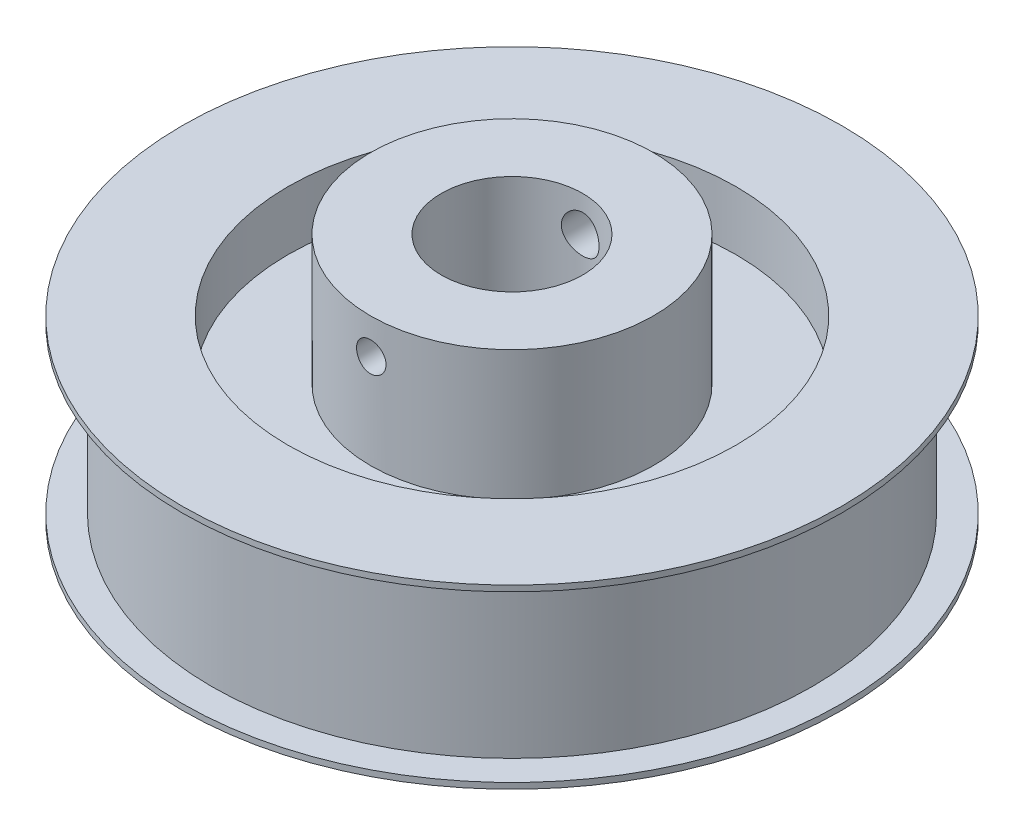
ISO-10303-21;
HEADER;
FILE_DESCRIPTION(('STEP AP214'),'2;1');
FILE_NAME('part.step','',(''),(''),'','','');
FILE_SCHEMA(('AUTOMOTIVE_DESIGN { 1 0 10303 214 1 1 1 1 }'));
ENDSEC;
DATA;
#1=APPLICATION_CONTEXT('core data for automotive mechanical design processes');
#2=APPLICATION_PROTOCOL_DEFINITION('international standard','automotive_design',2000,#1);
#3=PRODUCT_CONTEXT('',#1,'mechanical');
#4=PRODUCT('Part','Part','',(#3));
#5=PRODUCT_RELATED_PRODUCT_CATEGORY('part','',(#4));
#6=PRODUCT_DEFINITION_FORMATION('','',#4);
#7=PRODUCT_DEFINITION_CONTEXT('part definition',#1,'design');
#8=PRODUCT_DEFINITION('design','',#6,#7);
#9=PRODUCT_DEFINITION_SHAPE('','',#8);
#10=(LENGTH_UNIT() NAMED_UNIT(*) SI_UNIT(.MILLI.,.METRE.));
#11=(NAMED_UNIT(*) PLANE_ANGLE_UNIT() SI_UNIT($,.RADIAN.));
#12=(NAMED_UNIT(*) SI_UNIT($,.STERADIAN.) SOLID_ANGLE_UNIT());
#13=UNCERTAINTY_MEASURE_WITH_UNIT(LENGTH_MEASURE(1.E-05),#10,'distance_accuracy_value','');
#14=(GEOMETRIC_REPRESENTATION_CONTEXT(3) GLOBAL_UNCERTAINTY_ASSIGNED_CONTEXT((#13)) GLOBAL_UNIT_ASSIGNED_CONTEXT((#10,
#11,#12)) REPRESENTATION_CONTEXT('',''));
#15=CARTESIAN_POINT('',(0.,0.,0.));
#16=DIRECTION('',(0.,0.,1.));
#17=DIRECTION('',(1.,0.,0.));
#18=AXIS2_PLACEMENT_3D('',#15,#16,#17);
#19=CARTESIAN_POINT('',(0.,13.5,0.));
#20=DIRECTION('',(0.,1.,0.));
#21=DIRECTION('',(0.,0.,1.));
#22=AXIS2_PLACEMENT_3D('',#19,#20,#21);
#23=PLANE('',#22);
#24=CARTESIAN_POINT('',(0.,13.5,0.));
#25=DIRECTION('',(0.,1.,0.));
#26=DIRECTION('',(0.,0.,1.));
#27=AXIS2_PLACEMENT_3D('',#24,#25,#26);
#28=CIRCLE('',#27,6.);
#29=CARTESIAN_POINT('',(0.,13.5,6.));
#30=VERTEX_POINT('',#29);
#31=EDGE_CURVE('E69',#30,#30,#28,.T.);
#32=ORIENTED_EDGE('',*,*,#31,.F.);
#33=EDGE_LOOP('',(#32));
#34=FACE_BOUND('',#33,.T.);
#35=CARTESIAN_POINT('',(0.,13.5,0.));
#36=DIRECTION('',(0.,1.,0.));
#37=DIRECTION('',(0.,0.,1.));
#38=AXIS2_PLACEMENT_3D('',#35,#36,#37);
#39=CIRCLE('',#38,12.);
#40=CARTESIAN_POINT('',(0.,13.5,12.));
#41=VERTEX_POINT('',#40);
#42=EDGE_CURVE('E79',#41,#41,#39,.T.);
#43=ORIENTED_EDGE('',*,*,#42,.T.);
#44=EDGE_LOOP('',(#43));
#45=FACE_BOUND('',#44,.T.);
#46=ADVANCED_FACE('F43',(#34,#45),#23,.T.);
#47=CARTESIAN_POINT('',(0.,7.5,0.));
#48=DIRECTION('',(0.,-1.,0.));
#49=DIRECTION('',(0.,0.,-1.));
#50=AXIS2_PLACEMENT_3D('',#47,#48,#49);
#51=CYLINDRICAL_SURFACE('',#50,25.465);
#52=CARTESIAN_POINT('',(0.,-7.,0.));
#53=DIRECTION('',(0.,1.,0.));
#54=DIRECTION('',(0.,0.,1.));
#55=AXIS2_PLACEMENT_3D('',#52,#53,#54);
#56=CIRCLE('',#55,25.465);
#57=CARTESIAN_POINT('',(0.,-7.,25.465));
#58=VERTEX_POINT('',#57);
#59=EDGE_CURVE('E47',#58,#58,#56,.T.);
#60=ORIENTED_EDGE('',*,*,#59,.T.);
#61=EDGE_LOOP('',(#60));
#62=FACE_BOUND('',#61,.T.);
#63=CARTESIAN_POINT('',(0.,7.,0.));
#64=DIRECTION('',(0.,1.,0.));
#65=DIRECTION('',(0.,0.,1.));
#66=AXIS2_PLACEMENT_3D('',#63,#64,#65);
#67=CIRCLE('',#66,25.465);
#68=CARTESIAN_POINT('',(0.,7.,25.465));
#69=VERTEX_POINT('',#68);
#70=EDGE_CURVE('E11',#69,#69,#67,.T.);
#71=ORIENTED_EDGE('',*,*,#70,.F.);
#72=EDGE_LOOP('',(#71));
#73=FACE_BOUND('',#72,.T.);
#74=ADVANCED_FACE('F45',(#62,#73),#51,.T.);
#75=CARTESIAN_POINT('',(0.,7.,0.));
#76=DIRECTION('',(0.,1.,0.));
#77=DIRECTION('',(0.,0.,1.));
#78=AXIS2_PLACEMENT_3D('',#75,#76,#77);
#79=CYLINDRICAL_SURFACE('',#78,27.965);
#80=CARTESIAN_POINT('',(0.,7.,0.));
#81=DIRECTION('',(0.,1.,0.));
#82=DIRECTION('',(0.,0.,1.));
#83=AXIS2_PLACEMENT_3D('',#80,#81,#82);
#84=CIRCLE('',#83,27.965);
#85=CARTESIAN_POINT('',(0.,7.,27.965));
#86=VERTEX_POINT('',#85);
#87=EDGE_CURVE('E51',#86,#86,#84,.T.);
#88=ORIENTED_EDGE('',*,*,#87,.T.);
#89=EDGE_LOOP('',(#88));
#90=FACE_BOUND('',#89,.T.);
#91=CARTESIAN_POINT('',(0.,7.5,0.));
#92=DIRECTION('',(0.,1.,0.));
#93=DIRECTION('',(0.,0.,1.));
#94=AXIS2_PLACEMENT_3D('',#91,#92,#93);
#95=CIRCLE('',#94,27.965);
#96=CARTESIAN_POINT('',(0.,7.5,27.965));
#97=VERTEX_POINT('',#96);
#98=EDGE_CURVE('E55',#97,#97,#95,.T.);
#99=ORIENTED_EDGE('',*,*,#98,.F.);
#100=EDGE_LOOP('',(#99));
#101=FACE_BOUND('',#100,.T.);
#102=ADVANCED_FACE('F131',(#90,#101),#79,.T.);
#103=CARTESIAN_POINT('',(0.,7.,0.));
#104=DIRECTION('',(0.,1.,0.));
#105=DIRECTION('',(0.,0.,1.));
#106=AXIS2_PLACEMENT_3D('',#103,#104,#105);
#107=PLANE('',#106);
#108=ORIENTED_EDGE('',*,*,#70,.T.);
#109=EDGE_LOOP('',(#108));
#110=FACE_BOUND('',#109,.T.);
#111=ORIENTED_EDGE('',*,*,#87,.F.);
#112=EDGE_LOOP('',(#111));
#113=FACE_BOUND('',#112,.T.);
#114=ADVANCED_FACE('F148',(#110,#113),#107,.F.);
#115=CARTESIAN_POINT('',(0.,7.5,0.));
#116=DIRECTION('',(0.,1.,0.));
#117=DIRECTION('',(0.,0.,1.));
#118=AXIS2_PLACEMENT_3D('',#115,#116,#117);
#119=PLANE('',#118);
#120=CARTESIAN_POINT('',(0.,7.49999999999999,0.));
#121=DIRECTION('',(0.,1.,0.));
#122=DIRECTION('',(0.,0.,1.));
#123=AXIS2_PLACEMENT_3D('',#120,#121,#122);
#124=CIRCLE('',#123,19.);
#125=CARTESIAN_POINT('',(0.,7.49999999999999,19.));
#126=VERTEX_POINT('',#125);
#127=EDGE_CURVE('E72',#126,#126,#124,.T.);
#128=ORIENTED_EDGE('',*,*,#127,.F.);
#129=EDGE_LOOP('',(#128));
#130=FACE_BOUND('',#129,.T.);
#131=ORIENTED_EDGE('',*,*,#98,.T.);
#132=EDGE_LOOP('',(#131));
#133=FACE_BOUND('',#132,.T.);
#134=ADVANCED_FACE('F146',(#130,#133),#119,.T.);
#135=CARTESIAN_POINT('',(0.,-7.,0.));
#136=DIRECTION('',(0.,-1.,0.));
#137=DIRECTION('',(0.,0.,-1.));
#138=AXIS2_PLACEMENT_3D('',#135,#136,#137);
#139=CYLINDRICAL_SURFACE('',#138,27.965);
#140=CARTESIAN_POINT('',(0.,-7.,0.));
#141=DIRECTION('',(0.,1.,0.));
#142=DIRECTION('',(0.,0.,1.));
#143=AXIS2_PLACEMENT_3D('',#140,#141,#142);
#144=CIRCLE('',#143,27.965);
#145=CARTESIAN_POINT('',(0.,-7.,27.965));
#146=VERTEX_POINT('',#145);
#147=EDGE_CURVE('E63',#146,#146,#144,.T.);
#148=ORIENTED_EDGE('',*,*,#147,.F.);
#149=EDGE_LOOP('',(#148));
#150=FACE_BOUND('',#149,.T.);
#151=CARTESIAN_POINT('',(0.,-7.5,0.));
#152=DIRECTION('',(0.,1.,0.));
#153=DIRECTION('',(0.,0.,1.));
#154=AXIS2_PLACEMENT_3D('',#151,#152,#153);
#155=CIRCLE('',#154,27.965);
#156=CARTESIAN_POINT('',(0.,-7.5,27.965));
#157=VERTEX_POINT('',#156);
#158=EDGE_CURVE('E60',#157,#157,#155,.T.);
#159=ORIENTED_EDGE('',*,*,#158,.T.);
#160=EDGE_LOOP('',(#159));
#161=FACE_BOUND('',#160,.T.);
#162=ADVANCED_FACE('F142',(#150,#161),#139,.T.);
#163=CARTESIAN_POINT('',(0.,-7.,0.));
#164=DIRECTION('',(0.,1.,0.));
#165=DIRECTION('',(0.,0.,1.));
#166=AXIS2_PLACEMENT_3D('',#163,#164,#165);
#167=PLANE('',#166);
#168=ORIENTED_EDGE('',*,*,#59,.F.);
#169=EDGE_LOOP('',(#168));
#170=FACE_BOUND('',#169,.T.);
#171=ORIENTED_EDGE('',*,*,#147,.T.);
#172=EDGE_LOOP('',(#171));
#173=FACE_BOUND('',#172,.T.);
#174=ADVANCED_FACE('F138',(#170,#173),#167,.T.);
#175=CARTESIAN_POINT('',(0.,-7.5,0.));
#176=DIRECTION('',(0.,1.,0.));
#177=DIRECTION('',(0.,0.,1.));
#178=AXIS2_PLACEMENT_3D('',#175,#176,#177);
#179=PLANE('',#178);
#180=CARTESIAN_POINT('',(0.,-7.5,0.));
#181=DIRECTION('',(0.,1.,0.));
#182=DIRECTION('',(0.,0.,1.));
#183=AXIS2_PLACEMENT_3D('',#180,#181,#182);
#184=CIRCLE('',#183,6.);
#185=CARTESIAN_POINT('',(0.,-7.5,6.));
#186=VERTEX_POINT('',#185);
#187=EDGE_CURVE('E64',#186,#186,#184,.T.);
#188=ORIENTED_EDGE('',*,*,#187,.T.);
#189=EDGE_LOOP('',(#188));
#190=FACE_BOUND('',#189,.T.);
#191=ORIENTED_EDGE('',*,*,#158,.F.);
#192=EDGE_LOOP('',(#191));
#193=FACE_BOUND('',#192,.T.);
#194=ADVANCED_FACE('F141',(#190,#193),#179,.F.);
#195=CARTESIAN_POINT('',(0.,-7.5,0.));
#196=DIRECTION('',(0.,1.,0.));
#197=DIRECTION('',(0.,0.,1.));
#198=AXIS2_PLACEMENT_3D('',#195,#196,#197);
#199=CYLINDRICAL_SURFACE('',#198,6.);
#200=CARTESIAN_POINT('',(-1.6,10.5,-5.78273291792039));
#201=CARTESIAN_POINT('',(-1.59999787452612,10.411859249809,-5.7827344455633));
#202=CARTESIAN_POINT('',(-1.59269194579771,10.3236959996195,-5.78477011639344));
#203=CARTESIAN_POINT('',(-1.56371666608212,10.1499156627546,-5.79266848924472));
#204=CARTESIAN_POINT('',(-1.54204010896768,10.0642998760175,-5.79853311126453));
#205=CARTESIAN_POINT('',(-1.48508676448053,9.89815354404267,-5.81337900141366));
#206=CARTESIAN_POINT('',(-1.4498291003374,9.81761603293728,-5.82235588547335));
#207=CARTESIAN_POINT('',(-1.36677427650964,9.66358660795212,-5.8424092393635));
#208=CARTESIAN_POINT('',(-1.3189761427316,9.5900952419944,-5.85348587227547));
#209=CARTESIAN_POINT('',(-1.21091878299647,9.45040596240983,-5.87680111642766));
#210=CARTESIAN_POINT('',(-1.15040238003366,9.38441038602843,-5.88906032893152));
#211=CARTESIAN_POINT('',(-1.01917941827217,9.26337473843904,-5.91318161149208));
#212=CARTESIAN_POINT('',(-0.948471804277313,9.20833580308657,-5.92504364026752));
#213=CARTESIAN_POINT('',(-0.797470536698613,9.10993204927766,-5.94726390774734));
#214=CARTESIAN_POINT('',(-0.717041455903581,9.06676838509372,-5.95759501009834));
#215=CARTESIAN_POINT('',(-0.54974643578327,8.9946522917062,-5.97535300969467));
#216=CARTESIAN_POINT('',(-0.46288158470008,8.96569746617476,-5.9827803966101));
#217=CARTESIAN_POINT('',(-0.28729276944807,8.92347582381139,-5.99374842861169));
#218=CARTESIAN_POINT('',(-0.198656979360731,8.90986481869927,-5.99737421400212));
#219=CARTESIAN_POINT('',(-0.0202908428068591,8.89763430391426,-6.000628196942));
#220=CARTESIAN_POINT('',(0.0694393179508251,8.89901228509589,-6.00025706357286));
#221=CARTESIAN_POINT('',(0.245051389689078,8.91647825003158,-5.99562140687813));
#222=CARTESIAN_POINT('',(0.330973280576889,8.93219436610904,-5.99145531221602));
#223=CARTESIAN_POINT('',(0.498913052456844,8.97728971022556,-5.97981398872374));
#224=CARTESIAN_POINT('',(0.580930710544465,9.00666971734884,-5.97233857120463));
#225=CARTESIAN_POINT('',(0.739683156118043,9.07854387807391,-5.95477255279923));
#226=CARTESIAN_POINT('',(0.816357349063632,9.12116544568057,-5.94465670302171));
#227=CARTESIAN_POINT('',(0.961591999011612,9.21821505560728,-5.9228997480757));
#228=CARTESIAN_POINT('',(1.03015087046869,9.27264539922254,-5.91125834578275));
#229=CARTESIAN_POINT('',(1.15942829557249,9.39374148634714,-5.88729018351104));
#230=CARTESIAN_POINT('',(1.21984153614219,9.46073155603952,-5.87495335495478));
#231=CARTESIAN_POINT('',(1.32865065683815,9.60401974099103,-5.85130724018329));
#232=CARTESIAN_POINT('',(1.37704580423844,9.68031842336025,-5.83999801664631));
#233=CARTESIAN_POINT('',(1.46067743349021,9.84072008145716,-5.81964721826454));
#234=CARTESIAN_POINT('',(1.49583093280429,9.92486828073094,-5.81062005680583));
#235=CARTESIAN_POINT('',(1.55139201348531,10.0981811995636,-5.79603460063156));
#236=CARTESIAN_POINT('',(1.57180325169042,10.1873446691587,-5.79047544571885));
#237=CARTESIAN_POINT('',(1.59677405674218,10.3653017688173,-5.78363868515234));
#238=CARTESIAN_POINT('',(1.60178906096974,10.4540268388886,-5.78223810662157));
#239=CARTESIAN_POINT('',(1.597079848984,10.631047818242,-5.78354062803713));
#240=CARTESIAN_POINT('',(1.58735720137773,10.7193437721938,-5.78624329125356));
#241=CARTESIAN_POINT('',(1.55385017495931,10.8912452752781,-5.79532899431386));
#242=CARTESIAN_POINT('',(1.53033958330325,10.9749083503511,-5.80164031753083));
#243=CARTESIAN_POINT('',(1.47023189380391,11.1371037050867,-5.81716215168585));
#244=CARTESIAN_POINT('',(1.43363308701324,11.2156353131416,-5.82637304120572));
#245=CARTESIAN_POINT('',(1.34746324406962,11.3672439659485,-5.84690857976629));
#246=CARTESIAN_POINT('',(1.29762476190338,11.4401631807119,-5.8582752389782));
#247=CARTESIAN_POINT('',(1.18672182390012,11.5767706413624,-5.88174273547405));
#248=CARTESIAN_POINT('',(1.12565525778373,11.6404571479633,-5.89384371048319));
#249=CARTESIAN_POINT('',(0.991923026003868,11.7586819786,-5.91783971907433));
#250=CARTESIAN_POINT('',(0.918973132807074,11.8129027015829,-5.92971869219044));
#251=CARTESIAN_POINT('',(0.764742748752592,11.9083287899284,-5.95157336013737));
#252=CARTESIAN_POINT('',(0.683462701615105,11.9495348480631,-5.96154915626333));
#253=CARTESIAN_POINT('',(0.515451307860694,12.0173837058892,-5.978409207194));
#254=CARTESIAN_POINT('',(0.428766282305865,12.0441352155548,-5.98531646784308));
#255=CARTESIAN_POINT('',(0.251919507785054,12.0826309824515,-5.99536243029798));
#256=CARTESIAN_POINT('',(0.161758533856197,12.0943785654198,-5.99850196723977));
#257=CARTESIAN_POINT('',(-0.016513601076927,12.1023246589931,-6.0006193075016));
#258=CARTESIAN_POINT('',(-0.104602809222312,12.0989890553049,-5.99972181030494));
#259=CARTESIAN_POINT('',(-0.278918643704558,12.0779452051399,-5.9941479278306));
#260=CARTESIAN_POINT('',(-0.365145339850185,12.0602374983065,-5.98947168443723));
#261=CARTESIAN_POINT('',(-0.532728098771437,12.011215516065,-5.97689048312844));
#262=CARTESIAN_POINT('',(-0.614113609481484,11.9799957652217,-5.96900797751776));
#263=CARTESIAN_POINT('',(-0.770537678776834,11.9049203186034,-5.95083853212803));
#264=CARTESIAN_POINT('',(-0.845575345328786,11.8610628507112,-5.9405512551794));
#265=CARTESIAN_POINT('',(-0.989342614939897,11.7605933822889,-5.91833064980799));
#266=CARTESIAN_POINT('',(-1.05785068939028,11.7036724954356,-5.90636074702983));
#267=CARTESIAN_POINT('',(-1.18450029724544,11.5792778005135,-5.88227200056129));
#268=CARTESIAN_POINT('',(-1.24263909793084,11.5118012193649,-5.87015311850574));
#269=CARTESIAN_POINT('',(-1.34816560187261,11.3664252833275,-5.84683167732792));
#270=CARTESIAN_POINT('',(-1.39528875413901,11.2883293490008,-5.83565513061492));
#271=CARTESIAN_POINT('',(-1.47566951228968,11.1250349512375,-5.81585115203583));
#272=CARTESIAN_POINT('',(-1.50893618695116,11.0398411771482,-5.80722205399804));
#273=CARTESIAN_POINT('',(-1.5563049940103,10.8791349311728,-5.79468800506476));
#274=CARTESIAN_POINT('',(-1.57265214719334,10.8043189883583,-5.79024112213281));
#275=CARTESIAN_POINT('',(-1.5944999543536,10.6530075536011,-5.78426308173731));
#276=CARTESIAN_POINT('',(-1.60000184505801,10.5765122541679,-5.78273159182091));
#277=CARTESIAN_POINT('',(-1.6,10.5,-5.78273291792039));
#278=B_SPLINE_CURVE_WITH_KNOTS('',3,(#200,#201,#202,#203,#204,#205,#206,#207,#208,#209,#210,
#211,#212,#213,#214,#215,#216,#217,#218,#219,#220,#221,#222,#223,#224,#225,#226,#227,#228,#229,
#230,#231,#232,#233,#234,#235,#236,#237,#238,#239,#240,#241,#242,#243,#244,#245,#246,#247,#248,
#249,#250,#251,#252,#253,#254,#255,#256,#257,#258,#259,#260,#261,#262,#263,#264,#265,#266,#267,
#268,#269,#270,#271,#272,#273,#274,#275,#276,#277),.UNSPECIFIED.,.T.,.F.,(4,2,2,2,2,2,2,2,2,2,2,
2,2,2,2,2,2,2,2,2,2,2,2,2,2,2,2,2,2,2,2,2,2,2,2,2,2,2,4),(0.,0.264140902492819,
0.528414358280161,0.792317049276935,1.05624024524884,1.32612732904169,1.59604237699569,
1.87028165896642,2.14447467443397,2.41238643453184,2.68025334708482,2.94136456640642,
3.20249067552556,3.46621159124456,3.72998394715593,4.00185409840264,4.27374082111663,
4.54730412077229,4.82079953934806,5.08612267391536,5.35141757070658,5.61161480341915,
5.87184602287714,6.13779707970073,6.40379817229034,6.67748725563561,6.95116176802337,
7.22274831668975,7.49427465563059,7.75747243929025,8.02066034086224,8.28203611890787,
8.54344856608625,8.81183083189116,9.08028372300692,9.35464031183426,9.62881705674849,
9.85813574131028,10.0874282742632),.UNSPECIFIED.);
#279=CARTESIAN_POINT('',(-1.6,10.5,-5.78273291792039));
#280=VERTEX_POINT('',#279);
#281=EDGE_CURVE('E173',#280,#280,#278,.T.);
#282=ORIENTED_EDGE('',*,*,#281,.F.);
#283=EDGE_LOOP('',(#282));
#284=FACE_BOUND('',#283,.T.);
#285=ORIENTED_EDGE('',*,*,#187,.F.);
#286=EDGE_LOOP('',(#285));
#287=FACE_BOUND('',#286,.T.);
#288=ORIENTED_EDGE('',*,*,#31,.T.);
#289=EDGE_LOOP('',(#288));
#290=FACE_BOUND('',#289,.T.);
#291=CARTESIAN_POINT('',(0.,9.25000000000001,6.));
#292=CARTESIAN_POINT('',(0.0694090417016607,9.25000247746923,5.99999871526651));
#293=CARTESIAN_POINT('',(0.138848789520876,9.25580066571875,5.99878328775043));
#294=CARTESIAN_POINT('',(0.275761316266993,9.27881934953285,5.9940520099068));
#295=CARTESIAN_POINT('',(0.343232560128312,9.29604852303693,5.99053441189248));
#296=CARTESIAN_POINT('',(0.474209132291341,9.34137045492182,5.98159109196202));
#297=CARTESIAN_POINT('',(0.537718336709183,9.36945239599889,5.97616727052645));
#298=CARTESIAN_POINT('',(0.659120328605956,9.43564960885618,5.96399927809859));
#299=CARTESIAN_POINT('',(0.717013367534325,9.47376443115583,5.95725516625975));
#300=CARTESIAN_POINT('',(0.826390324308835,9.55953634019065,5.9430770002465));
#301=CARTESIAN_POINT('',(0.877780244162683,9.60731200123508,5.93563505848531));
#302=CARTESIAN_POINT('',(0.971877776769391,9.71079465919511,5.92095657692448));
#303=CARTESIAN_POINT('',(1.01458467096099,9.76650231187227,5.91372005416683));
#304=CARTESIAN_POINT('',(1.09051031677217,9.88495196876616,5.90019442595308));
#305=CARTESIAN_POINT('',(1.12363054680651,9.94775838450274,5.89391545174828));
#306=CARTESIAN_POINT('',(1.17881119348064,10.0781974517728,5.8831284065002));
#307=CARTESIAN_POINT('',(1.20087280167641,10.1458295824425,5.87862014467568));
#308=CARTESIAN_POINT('',(1.23300240133737,10.2829852374156,5.87196500986123));
#309=CARTESIAN_POINT('',(1.24323597696799,10.3524683593348,5.86978556855865));
#310=CARTESIAN_POINT('',(1.25193357655614,10.4921968428626,5.86793690716491));
#311=CARTESIAN_POINT('',(1.25039890894687,10.5624421188653,5.86826740800981));
#312=CARTESIAN_POINT('',(1.23573719037197,10.7004810279752,5.87137174319175));
#313=CARTESIAN_POINT('',(1.2228010523272,10.7682959796612,5.87410533679901));
#314=CARTESIAN_POINT('',(1.18600543529945,10.9007715096449,5.88164437615942));
#315=CARTESIAN_POINT('',(1.16214539481382,10.9654319256063,5.88644992841317));
#316=CARTESIAN_POINT('',(1.10400003213928,11.090307228416,5.89763191464102));
#317=CARTESIAN_POINT('',(1.06964002534237,11.1504862965271,5.90401953785586));
#318=CARTESIAN_POINT('',(0.991522699274816,11.2642957442682,5.91763890010721));
#319=CARTESIAN_POINT('',(0.947764212262585,11.317925308836,5.92487074398537));
#320=CARTESIAN_POINT('',(0.851074921546781,11.4182139610804,5.93953730929909));
#321=CARTESIAN_POINT('',(0.79798143341208,11.464716168897,5.94697323199473));
#322=CARTESIAN_POINT('',(0.684667288611796,11.548180442229,5.96108088143001));
#323=CARTESIAN_POINT('',(0.624446525025763,11.5851423645984,5.96775259670236));
#324=CARTESIAN_POINT('',(0.498405541235476,11.648510081536,5.97959870942815));
#325=CARTESIAN_POINT('',(0.432575461926498,11.6748968045671,5.98477039710258));
#326=CARTESIAN_POINT('',(0.297284620972155,11.7161917048355,5.99301338211281));
#327=CARTESIAN_POINT('',(0.227824338595089,11.7311013932314,5.99608495596053));
#328=CARTESIAN_POINT('',(0.0885918657008346,11.7487942520679,5.99974275215456));
#329=CARTESIAN_POINT('',(0.0188480555261781,11.7517919414942,6.00037293537579));
#330=CARTESIAN_POINT('',(-0.120143798757715,11.7461550500309,5.99919952252774));
#331=CARTESIAN_POINT('',(-0.189391872962258,11.7375211813984,5.99739607548153));
#332=CARTESIAN_POINT('',(-0.324726367119813,11.7090443465305,5.99158564979184));
#333=CARTESIAN_POINT('',(-0.390837192894206,11.6893125146165,5.98760052868077));
#334=CARTESIAN_POINT('',(-0.518811446661331,11.6393221395786,5.97787227242395));
#335=CARTESIAN_POINT('',(-0.580674536336775,11.609062759134,5.97212899744579));
#336=CARTESIAN_POINT('',(-0.699294306943493,11.5384196217624,5.95941241490714));
#337=CARTESIAN_POINT('',(-0.755973219469833,11.4979080704309,5.9524239381233));
#338=CARTESIAN_POINT('',(-0.861805445886519,11.4080804369237,5.93802568299709));
#339=CARTESIAN_POINT('',(-0.910957877913284,11.3587633244811,5.93061585542511));
#340=CARTESIAN_POINT('',(-1.0011786486518,11.2517444230003,5.91606024531377));
#341=CARTESIAN_POINT('',(-1.04209914600204,11.1939169680447,5.90892089307501));
#342=CARTESIAN_POINT('',(-1.11364719079243,11.0720837157862,5.89585601015805));
#343=CARTESIAN_POINT('',(-1.14427516677864,11.0080781758609,5.88993042894651));
#344=CARTESIAN_POINT('',(-1.19417246443922,10.8760388037018,5.88001700708041));
#345=CARTESIAN_POINT('',(-1.21350309828031,10.8080289628342,5.87601872784687));
#346=CARTESIAN_POINT('',(-1.24044038523407,10.6696334495077,5.87039184709697));
#347=CARTESIAN_POINT('',(-1.24804871544441,10.5992481183806,5.86876290660367));
#348=CARTESIAN_POINT('',(-1.25125926487611,10.4595865990004,5.86807907308506));
#349=CARTESIAN_POINT('',(-1.24709542622725,10.3903159297779,5.86897402321502));
#350=CARTESIAN_POINT('',(-1.22739905314031,10.2534859910798,5.87312447254928));
#351=CARTESIAN_POINT('',(-1.21186662782266,10.1859267051839,5.87637994909626));
#352=CARTESIAN_POINT('',(-1.16998217768585,10.0546022281093,5.88486132447716));
#353=CARTESIAN_POINT('',(-1.14366117568421,9.99082675351308,5.8900815700793));
#354=CARTESIAN_POINT('',(-1.08097457299757,9.86856122397334,5.90190705738738));
#355=CARTESIAN_POINT('',(-1.0446080398303,9.81007166036688,5.9085124276546));
#356=CARTESIAN_POINT('',(-0.962073695342408,9.69887837292056,5.92251579551146));
#357=CARTESIAN_POINT('',(-0.915737890418223,9.64630087543502,5.92992613868404));
#358=CARTESIAN_POINT('',(-0.814924438115332,9.54959050677364,5.94461839583213));
#359=CARTESIAN_POINT('',(-0.760444918832965,9.50545958244852,5.9519002798488));
#360=CARTESIAN_POINT('',(-0.644134427507701,9.42641142681594,5.96561444547638));
#361=CARTESIAN_POINT('',(-0.582225921521346,9.39160632011372,5.97203596073244));
#362=CARTESIAN_POINT('',(-0.453319843998452,9.33294977156998,5.98319908494092));
#363=CARTESIAN_POINT('',(-0.386326781907243,9.30908875281813,5.98794216182101));
#364=CARTESIAN_POINT('',(-0.266015292900105,9.27745972171158,5.99432499781444));
#365=CARTESIAN_POINT('',(-0.213367593727929,9.26718123679115,5.99644035661395));
#366=CARTESIAN_POINT('',(-0.107152674176537,9.25345054572267,5.99927832789758));
#367=CARTESIAN_POINT('',(-0.0535854878488717,9.24999808733281,6.00000099184586));
#368=CARTESIAN_POINT('',(0.,9.25000000000001,6.));
#369=B_SPLINE_CURVE_WITH_KNOTS('',3,(#291,#292,#293,#294,#295,#296,#297,#298,#299,#300,#301,
#302,#303,#304,#305,#306,#307,#308,#309,#310,#311,#312,#313,#314,#315,#316,#317,#318,#319,#320,
#321,#322,#323,#324,#325,#326,#327,#328,#329,#330,#331,#332,#333,#334,#335,#336,#337,#338,#339,
#340,#341,#342,#343,#344,#345,#346,#347,#348,#349,#350,#351,#352,#353,#354,#355,#356,#357,#358,
#359,#360,#361,#362,#363,#364,#365,#366,#367,#368),.UNSPECIFIED.,.T.,.F.,(4,2,2,2,2,2,2,2,2,2,2,
2,2,2,2,2,2,2,2,2,2,2,2,2,2,2,2,2,2,2,2,2,2,2,2,2,2,2,4),(0.,0.208031045103183,
0.416220199906224,0.624202378825441,0.832175241572988,1.04287526388122,1.25359271551786,
1.46640449178548,1.6791933328549,1.88896575169854,2.09871484767164,2.30501712129059,
2.51133000030279,2.71914592416749,2.92698768368034,3.13889526355465,3.35080602278217,
3.56309724499662,3.77536051045771,3.98378339407675,4.19219351552277,4.39855286632621,
4.60492863390932,4.81401583995736,5.02312752564573,5.23571263829335,5.44828889851308,
5.65970050095024,5.87108185414184,6.07829223291037,6.2855006228136,6.49211731393254,
6.69875319081479,6.90919024830308,7.11967575117368,7.33258864398255,7.54531486464972,
7.70592588477278,7.8665309697339),.UNSPECIFIED.);
#370=CARTESIAN_POINT('',(0.,9.25000000000001,6.));
#371=VERTEX_POINT('',#370);
#372=EDGE_CURVE('E92',#371,#371,#369,.T.);
#373=ORIENTED_EDGE('',*,*,#372,.T.);
#374=EDGE_LOOP('',(#373));
#375=FACE_BOUND('',#374,.T.);
#376=ADVANCED_FACE('F137',(#284,#287,#290,#375),#199,.F.);
#377=CARTESIAN_POINT('',(0.,-61.2401153701776,0.));
#378=DIRECTION('',(0.,1.,0.));
#379=DIRECTION('',(0.,0.,1.));
#380=AXIS2_PLACEMENT_3D('',#377,#378,#379);
#381=CYLINDRICAL_SURFACE('',#380,19.);
#382=ORIENTED_EDGE('',*,*,#127,.T.);
#383=EDGE_LOOP('',(#382));
#384=FACE_BOUND('',#383,.T.);
#385=CARTESIAN_POINT('',(0.,2.5,0.));
#386=DIRECTION('',(0.,1.,0.));
#387=DIRECTION('',(0.,0.,1.));
#388=AXIS2_PLACEMENT_3D('',#385,#386,#387);
#389=CIRCLE('',#388,19.);
#390=CARTESIAN_POINT('',(0.,2.5,19.));
#391=VERTEX_POINT('',#390);
#392=EDGE_CURVE('E78',#391,#391,#389,.F.);
#393=ORIENTED_EDGE('',*,*,#392,.T.);
#394=EDGE_LOOP('',(#393));
#395=FACE_BOUND('',#394,.T.);
#396=ADVANCED_FACE('F120',(#384,#395),#381,.F.);
#397=CARTESIAN_POINT('',(0.,-61.2401153701776,0.));
#398=DIRECTION('',(0.,1.,0.));
#399=DIRECTION('',(0.,0.,1.));
#400=AXIS2_PLACEMENT_3D('',#397,#398,#399);
#401=CYLINDRICAL_SURFACE('',#400,12.);
#402=CARTESIAN_POINT('',(-1.6,10.5,-11.8928549978548));
#403=CARTESIAN_POINT('',(-1.59999622875874,10.5894430843682,-11.8928563562661));
#404=CARTESIAN_POINT('',(-1.59247461363655,10.6789408264743,-11.8938749179493));
#405=CARTESIAN_POINT('',(-1.56259037013244,10.8554419698511,-11.8978371896282));
#406=CARTESIAN_POINT('',(-1.54021255719325,10.9424427239303,-11.9007828692913));
#407=CARTESIAN_POINT('',(-1.48129048912082,11.1113690945872,-11.9082599369349));
#408=CARTESIAN_POINT('',(-1.44475624220001,11.1932982492958,-11.9127902044355));
#409=CARTESIAN_POINT('',(-1.35858051904583,11.349848860566,-11.9229246580757));
#410=CARTESIAN_POINT('',(-1.30894114610784,11.42447148715,-11.9285286718458));
#411=CARTESIAN_POINT('',(-1.19762696391605,11.5647787637352,-11.9402190185494));
#412=CARTESIAN_POINT('',(-1.13588545819885,11.6304102925436,-11.9463079079454));
#413=CARTESIAN_POINT('',(-1.0022633829809,11.750412996365,-11.9582590100703));
#414=CARTESIAN_POINT('',(-0.93038229317759,11.8047835931809,-11.9641212111471));
#415=CARTESIAN_POINT('',(-0.77818537994208,11.9009134733732,-11.9749847980817));
#416=CARTESIAN_POINT('',(-0.697838750168973,11.9426243914322,-11.9799828520179));
#417=CARTESIAN_POINT('',(-0.531203052829892,12.0119409313446,-11.9885268273268));
#418=CARTESIAN_POINT('',(-0.444914235137918,12.0395471459021,-11.9920728097169));
#419=CARTESIAN_POINT('',(-0.269388300011268,12.0797111276642,-11.9972950895648));
#420=CARTESIAN_POINT('',(-0.180171778775915,12.0923574520096,-11.9989823856406));
#421=CARTESIAN_POINT('',(-0.000868001842923064,12.1025172869895,-12.0003347837722));
#422=CARTESIAN_POINT('',(0.089219214977975,12.1000314701892,-11.9999999757026));
#423=CARTESIAN_POINT('',(0.267104099572617,12.0800682155672,-11.9973547529353));
#424=CARTESIAN_POINT('',(0.354912669889429,12.0626860282035,-11.9950568907025));
#425=CARTESIAN_POINT('',(0.526355298170045,12.0135725383828,-11.9887577927383));
#426=CARTESIAN_POINT('',(0.609989267633473,11.9818409318655,-11.9847565209123));
#427=CARTESIAN_POINT('',(0.771001446739304,11.9048292471025,-11.9754785520333));
#428=CARTESIAN_POINT('',(0.848359879482609,11.8595083014535,-11.970198017167));
#429=CARTESIAN_POINT('',(0.994409352587829,11.7566341941737,-11.9589516033523));
#430=CARTESIAN_POINT('',(1.06309994069345,11.6990803946978,-11.9529856886743));
#431=CARTESIAN_POINT('',(1.19042404923631,11.5728417213129,-11.9409807047653));
#432=CARTESIAN_POINT('',(1.24897522682417,11.5040737854451,-11.9349414273952));
#433=CARTESIAN_POINT('',(1.35371754445753,11.3576432549019,-11.9235159901539));
#434=CARTESIAN_POINT('',(1.39990863549082,11.2799806249576,-11.9181298328726));
#435=CARTESIAN_POINT('',(1.478626288692,11.1178879997226,-11.9086206106747));
#436=CARTESIAN_POINT('',(1.51114567125365,11.0334544763852,-11.9044982097183));
#437=CARTESIAN_POINT('',(1.56152072035939,10.8602575834893,-11.8979958037258));
#438=CARTESIAN_POINT('',(1.57937719483315,10.7714944527787,-11.8956157026893));
#439=CARTESIAN_POINT('',(1.59980928614981,10.592886931996,-11.8928851600828));
#440=CARTESIAN_POINT('',(1.60250104879049,10.503056055734,-11.892519292093));
#441=CARTESIAN_POINT('',(1.59283430551036,10.3242245951162,-11.8938177943736));
#442=CARTESIAN_POINT('',(1.58047616583821,10.2352239906084,-11.895482115238));
#443=CARTESIAN_POINT('',(1.54115844029615,10.0609312108755,-11.9006393634942));
#444=CARTESIAN_POINT('',(1.51425560258688,9.97562600558552,-11.9041251823012));
#445=CARTESIAN_POINT('',(1.446670760641,9.81073686923805,-11.9125268721153));
#446=CARTESIAN_POINT('',(1.40598820967506,9.73115316534103,-11.9174427998627));
#447=CARTESIAN_POINT('',(1.31171525133768,9.57944215164735,-11.9281875729561));
#448=CARTESIAN_POINT('',(1.2580489853304,9.50736236130541,-11.9340217103131));
#449=CARTESIAN_POINT('',(1.13943865850239,9.37319124925033,-11.9459291481321));
#450=CARTESIAN_POINT('',(1.07449409715003,9.31110037108159,-11.9520024591995));
#451=CARTESIAN_POINT('',(0.934662038686588,9.19825875686311,-11.9637515892427));
#452=CARTESIAN_POINT('',(0.859712512746017,9.14758454690271,-11.9694245603977));
#453=CARTESIAN_POINT('',(0.702297961854094,9.05954537425974,-11.9796907318264));
#454=CARTESIAN_POINT('',(0.619833106010957,9.02218011219512,-11.9842839563879));
#455=CARTESIAN_POINT('',(0.449978218018744,8.9619445907295,-11.9918605175292));
#456=CARTESIAN_POINT('',(0.362603827397887,8.93903085673316,-11.9948486785663));
#457=CARTESIAN_POINT('',(0.185205194738557,8.90820761163122,-11.9988985334929));
#458=CARTESIAN_POINT('',(0.0951810897598569,8.90029732583383,-11.999960326849));
#459=CARTESIAN_POINT('',(-0.0842158989692724,8.89972138620775,-12.0000371779874));
#460=CARTESIAN_POINT('',(-0.173588420737506,8.90693802352449,-11.9990680393074));
#461=CARTESIAN_POINT('',(-0.349837954441884,8.93616083298559,-11.9952234657589));
#462=CARTESIAN_POINT('',(-0.436714969872839,8.95816698441705,-11.9923480335601));
#463=CARTESIAN_POINT('',(-0.605486587671089,9.01630563766134,-11.9850124531398));
#464=CARTESIAN_POINT('',(-0.68738344123513,9.05243170112645,-11.9805530272665));
#465=CARTESIAN_POINT('',(-0.8439712629047,9.1377724397166,-11.9705419951679));
#466=CARTESIAN_POINT('',(-0.918662097919332,9.18698735652196,-11.9649903687759));
#467=CARTESIAN_POINT('',(-1.05931782885339,9.29754134560292,-11.9533623296788));
#468=CARTESIAN_POINT('',(-1.1252137257312,9.35896783211136,-11.9472823223993));
#469=CARTESIAN_POINT('',(-1.24580716469773,9.4920184552379,-11.9353109191741));
#470=CARTESIAN_POINT('',(-1.30050206024185,9.56364499513703,-11.9294195680805));
#471=CARTESIAN_POINT('',(-1.39735032782796,9.7154271532567,-11.9184648790805));
#472=CARTESIAN_POINT('',(-1.43944752343302,9.79561887320802,-11.9134052940863));
#473=CARTESIAN_POINT('',(-1.50951614625191,9.96195877401371,-11.9047309326699));
#474=CARTESIAN_POINT('',(-1.53750271733087,10.0481004558077,-11.9011146081783));
#475=CARTESIAN_POINT('',(-1.5719638430287,10.1955586229803,-11.8966010705995));
#476=CARTESIAN_POINT('',(-1.58246198508654,10.255950618374,-11.8952034289778));
#477=CARTESIAN_POINT('',(-1.59648132274533,10.3775532075769,-11.8933299317957));
#478=CARTESIAN_POINT('',(-1.6000025819381,10.4387637939198,-11.8928540678337));
#479=CARTESIAN_POINT('',(-1.6,10.5,-11.8928549978548));
#480=B_SPLINE_CURVE_WITH_KNOTS('',3,(#402,#403,#404,#405,#406,#407,#408,#409,#410,#411,#412,
#413,#414,#415,#416,#417,#418,#419,#420,#421,#422,#423,#424,#425,#426,#427,#428,#429,#430,#431,
#432,#433,#434,#435,#436,#437,#438,#439,#440,#441,#442,#443,#444,#445,#446,#447,#448,#449,#450,
#451,#452,#453,#454,#455,#456,#457,#458,#459,#460,#461,#462,#463,#464,#465,#466,#467,#468,#469,
#470,#471,#472,#473,#474,#475,#476,#477,#478,#479),.UNSPECIFIED.,.T.,.F.,(4,2,2,2,2,2,2,2,2,2,2,
2,2,2,2,2,2,2,2,2,2,2,2,2,2,2,2,2,2,2,2,2,2,2,2,2,2,2,4),(0.,0.268105511391281,
0.536485476866914,0.804676050196965,1.07282360666202,1.34249276095169,1.61217575808027,
1.88287645218354,2.15356577003779,2.42264455618212,2.69171138290122,2.95907046934199,
3.22643522131579,3.49461222763237,3.76280322065939,4.03307932053404,4.30335649213509,
4.57377542122829,4.84417944917518,5.1125096206378,5.3808332622507,5.64811747853112,
5.91541230092804,6.18430822512102,6.45321608598733,6.72387609409839,6.99453001338358,
7.26436579014504,7.53418763375954,7.80191767883276,8.06964734894749,8.33725508278391,
8.60486775823099,8.8744699389339,9.14413574725756,9.41498673583916,9.68554641848827,
9.86910352753639,10.0526589635184),.UNSPECIFIED.);
#481=CARTESIAN_POINT('',(-1.6,10.5,-11.8928549978548));
#482=VERTEX_POINT('',#481);
#483=EDGE_CURVE('E171',#482,#482,#480,.T.);
#484=ORIENTED_EDGE('',*,*,#483,.F.);
#485=EDGE_LOOP('',(#484));
#486=FACE_BOUND('',#485,.T.);
#487=CARTESIAN_POINT('',(0.,9.25,12.));
#488=CARTESIAN_POINT('',(0.0700095494879669,9.2500030237802,11.9999991642872));
#489=CARTESIAN_POINT('',(0.140065002410053,9.25590141119276,11.9993808287118));
#490=CARTESIAN_POINT('',(0.278232608485378,9.27934157732293,11.9969736264618));
#491=CARTESIAN_POINT('',(0.346342552614998,9.29689608246203,11.9951834804073));
#492=CARTESIAN_POINT('',(0.478598413117925,9.34313095006593,11.9906346712346));
#493=CARTESIAN_POINT('',(0.542746737320354,9.37180447580484,11.9878766033589));
#494=CARTESIAN_POINT('',(0.665306503912529,9.43944990943165,11.9817001005453));
#495=CARTESIAN_POINT('',(0.723719060185855,9.47841981232085,11.9782817942095));
#496=CARTESIAN_POINT('',(0.833390013644793,9.5657142953614,11.9711526751922));
#497=CARTESIAN_POINT('',(0.884622960494006,9.61407077334438,11.9674408914449));
#498=CARTESIAN_POINT('',(0.97826156200066,9.71869761231012,11.9601511575164));
#499=CARTESIAN_POINT('',(1.02066680237567,9.77496834449964,11.9565732136228));
#500=CARTESIAN_POINT('',(1.09553719669395,9.89398670534911,11.9499464131795));
#501=CARTESIAN_POINT('',(1.12797918293742,9.95674898299685,11.9468987968275));
#502=CARTESIAN_POINT('',(1.18185422718569,10.0868674028103,11.9416898936638));
#503=CARTESIAN_POINT('',(1.20328757896304,10.1542234223348,11.9395285832006));
#504=CARTESIAN_POINT('',(1.23446116549206,10.2913569487067,11.9363458728961));
#505=CARTESIAN_POINT('',(1.24424374803227,10.3611247315265,11.9353203457101));
#506=CARTESIAN_POINT('',(1.25196903004635,10.5013188561489,11.9345125354877));
#507=CARTESIAN_POINT('',(1.24991206557194,10.571745179203,11.9347302171641));
#508=CARTESIAN_POINT('',(1.23405152506975,10.7109648395856,11.9363804586047));
#509=CARTESIAN_POINT('',(1.22029424848266,10.7797635163118,11.9378082298324));
#510=CARTESIAN_POINT('',(1.18149567318239,10.9140701613045,11.9417102992231));
#511=CARTESIAN_POINT('',(1.1564542103875,10.9795780817052,11.9441846126035));
#512=CARTESIAN_POINT('',(1.09574719612483,11.1055895750614,11.9499064730576));
#513=CARTESIAN_POINT('',(1.06006116722708,11.1660832125459,11.953155508059));
#514=CARTESIAN_POINT('',(0.979092720135937,11.2802402034553,11.9600594875767));
#515=CARTESIAN_POINT('',(0.933809997063837,11.3339033397944,11.9637144449871));
#516=CARTESIAN_POINT('',(0.834675280938103,11.4331450273226,11.9710397802306));
#517=CARTESIAN_POINT('',(0.780783314157841,11.4786836581419,11.97471014815));
#518=CARTESIAN_POINT('',(0.666098532189395,11.5600740328825,11.9816362536886));
#519=CARTESIAN_POINT('',(0.605305708229911,11.5959257644912,11.9848919907809));
#520=CARTESIAN_POINT('',(0.478516764921767,11.6569232865542,11.9906232037876));
#521=CARTESIAN_POINT('',(0.412519629297687,11.6820669798228,11.9930985268321));
#522=CARTESIAN_POINT('',(0.277208837646706,11.7209050636913,11.9969884809875));
#523=CARTESIAN_POINT('',(0.2078952893403,11.7345998258976,11.9984031465247));
#524=CARTESIAN_POINT('',(0.0682648586938707,11.7501004938849,12.0000079610362));
#525=CARTESIAN_POINT('',(-0.00204584741646056,11.7519614723098,12.0002037822377));
#526=CARTESIAN_POINT('',(-0.141978142720368,11.7438864978735,11.9993640699192));
#527=CARTESIAN_POINT('',(-0.211599742015271,11.733950718195,11.9983285544758));
#528=CARTESIAN_POINT('',(-0.348018029476926,11.7026099671781,11.995146140952));
#529=CARTESIAN_POINT('',(-0.414820721686736,11.6812308538946,11.9930017489258));
#530=CARTESIAN_POINT('',(-0.543891723826279,11.6276369307205,11.98784207376));
#531=CARTESIAN_POINT('',(-0.606159923902424,11.5954218584218,11.9848267695301));
#532=CARTESIAN_POINT('',(-0.724642919002307,11.5209344106801,11.9782482392504));
#533=CARTESIAN_POINT('',(-0.780834909391514,11.4786259362103,11.9746830631459));
#534=CARTESIAN_POINT('',(-0.885339382882747,11.385204321023,11.9674108977167));
#535=CARTESIAN_POINT('',(-0.933651650991103,11.3340909401469,11.9637039045259));
#536=CARTESIAN_POINT('',(-1.02121712756248,11.2242697793095,11.9565487724948));
#537=CARTESIAN_POINT('',(-1.06043413579884,11.1655330556455,11.9531017036895));
#538=CARTESIAN_POINT('',(-1.12844682402802,11.0422749355989,11.9468731948153));
#539=CARTESIAN_POINT('',(-1.15724265694647,10.9777536241196,11.9440917449791));
#540=CARTESIAN_POINT('',(-1.2035352838692,10.844880883156,11.9395161797365));
#541=CARTESIAN_POINT('',(-1.22105344529625,10.776536964984,11.9377201981564));
#542=CARTESIAN_POINT('',(-1.24436270906373,10.6378579985983,11.9353131909021));
#543=CARTESIAN_POINT('',(-1.25015417898762,10.5675230128665,11.9347021280856));
#544=CARTESIAN_POINT('',(-1.24984031256419,10.4272183097891,11.9347349734758));
#545=CARTESIAN_POINT('',(-1.24379184136803,10.3572484569021,11.9353728830911));
#546=CARTESIAN_POINT('',(-1.22008919679213,10.2193247728113,11.9378189905869));
#547=CARTESIAN_POINT('',(-1.20243501187647,10.1513709436114,11.9396271896308));
#548=CARTESIAN_POINT('',(-1.15603809633997,10.0194097863068,11.9442084445198));
#549=CARTESIAN_POINT('',(-1.12729720150595,9.95540180686475,11.9469813406187));
#550=CARTESIAN_POINT('',(-1.05954851165036,9.83310909832282,11.9531798687626));
#551=CARTESIAN_POINT('',(-1.02054074557837,9.77482435308571,11.9566054989672));
#552=CARTESIAN_POINT('',(-0.933152337738085,9.66534121935873,11.9637432302473));
#553=CARTESIAN_POINT('',(-0.884729299095296,9.61417675195397,11.9674565796301));
#554=CARTESIAN_POINT('',(-0.779969862539382,9.52067534473859,11.9747399925001));
#555=CARTESIAN_POINT('',(-0.723631576825857,9.47834051681459,11.9783100215432));
#556=CARTESIAN_POINT('',(-0.604472478145269,9.40360857134285,11.9849147120146));
#557=CARTESIAN_POINT('',(-0.541634534666209,9.37123865741696,11.9879478984777));
#558=CARTESIAN_POINT('',(-0.411422843814932,9.31755350869123,11.9931213369361));
#559=CARTESIAN_POINT('',(-0.344054279006824,9.29622587774576,11.9952625896922));
#560=CARTESIAN_POINT('',(-0.230257563143004,9.27051681754003,11.9978761527569));
#561=CARTESIAN_POINT('',(-0.184555489720072,9.26283360450816,11.998668856663));
#562=CARTESIAN_POINT('',(-0.0925756340610823,9.2525742075801,11.999731055421));
#563=CARTESIAN_POINT('',(-0.0462978544563021,9.24999800035086,12.0000005526633));
#564=CARTESIAN_POINT('',(0.,9.25,12.));
#565=B_SPLINE_CURVE_WITH_KNOTS('',3,(#487,#488,#489,#490,#491,#492,#493,#494,#495,#496,#497,
#498,#499,#500,#501,#502,#503,#504,#505,#506,#507,#508,#509,#510,#511,#512,#513,#514,#515,#516,
#517,#518,#519,#520,#521,#522,#523,#524,#525,#526,#527,#528,#529,#530,#531,#532,#533,#534,#535,
#536,#537,#538,#539,#540,#541,#542,#543,#544,#545,#546,#547,#548,#549,#550,#551,#552,#553,#554,
#555,#556,#557,#558,#559,#560,#561,#562,#563,#564),.UNSPECIFIED.,.T.,.F.,(4,2,2,2,2,2,2,2,2,2,2,
2,2,2,2,2,2,2,2,2,2,2,2,2,2,2,2,2,2,2,2,2,2,2,2,2,2,2,4),(0.,0.209859578808884,
0.419948664798438,0.62990877811076,0.839828036286579,1.05047354994535,1.26112894692693,
1.47227053850523,1.68340649534034,1.89377265772063,2.10413284913259,2.3136644742687,
2.52319914627208,2.73313953815067,2.94308660065496,3.15403842947492,3.36499052642714,
3.5759839196883,3.78697046431324,3.9969743863569,4.20697522546865,4.41650352486907,
4.62603689865994,4.83633120945247,5.04663125704428,5.25775448481458,5.46887461432943,
5.67959355518835,5.89030589077467,6.10000869487957,6.30971170742627,6.51938001130894,
6.72904772399434,6.93968239830692,7.15036739491244,7.36162255036675,7.57264003223293,
7.71142242261123,7.8502041789147),.UNSPECIFIED.);
#566=CARTESIAN_POINT('',(0.,9.25,12.));
#567=VERTEX_POINT('',#566);
#568=EDGE_CURVE('E82',#567,#567,#565,.T.);
#569=ORIENTED_EDGE('',*,*,#568,.F.);
#570=EDGE_LOOP('',(#569));
#571=FACE_BOUND('',#570,.T.);
#572=CARTESIAN_POINT('',(0.,2.5,0.));
#573=DIRECTION('',(0.,1.,0.));
#574=DIRECTION('',(0.,0.,1.));
#575=AXIS2_PLACEMENT_3D('',#572,#573,#574);
#576=CIRCLE('',#575,12.);
#577=CARTESIAN_POINT('',(0.,2.5,12.));
#578=VERTEX_POINT('',#577);
#579=EDGE_CURVE('E75',#578,#578,#576,.F.);
#580=ORIENTED_EDGE('',*,*,#579,.F.);
#581=EDGE_LOOP('',(#580));
#582=FACE_BOUND('',#581,.T.);
#583=ORIENTED_EDGE('',*,*,#42,.F.);
#584=EDGE_LOOP('',(#583));
#585=FACE_BOUND('',#584,.T.);
#586=ADVANCED_FACE('F98',(#486,#571,#582,#585),#401,.T.);
#587=CARTESIAN_POINT('',(0.,2.5,0.));
#588=DIRECTION('',(0.,1.,0.));
#589=DIRECTION('',(0.,0.,1.));
#590=AXIS2_PLACEMENT_3D('',#587,#588,#589);
#591=PLANE('',#590);
#592=ORIENTED_EDGE('',*,*,#392,.F.);
#593=EDGE_LOOP('',(#592));
#594=FACE_BOUND('',#593,.T.);
#595=ORIENTED_EDGE('',*,*,#579,.T.);
#596=EDGE_LOOP('',(#595));
#597=FACE_BOUND('',#596,.T.);
#598=ADVANCED_FACE('F107',(#594,#597),#591,.T.);
#599=CARTESIAN_POINT('',(0.,10.5,12.));
#600=DIRECTION('',(0.,0.,1.));
#601=DIRECTION('',(1.,0.,0.));
#602=AXIS2_PLACEMENT_3D('',#599,#600,#601);
#603=CYLINDRICAL_SURFACE('',#602,1.25);
#604=ORIENTED_EDGE('',*,*,#568,.T.);
#605=EDGE_LOOP('',(#604));
#606=FACE_BOUND('',#605,.T.);
#607=ORIENTED_EDGE('',*,*,#372,.F.);
#608=EDGE_LOOP('',(#607));
#609=FACE_BOUND('',#608,.T.);
#610=ADVANCED_FACE('F102',(#606,#609),#603,.F.);
#611=CARTESIAN_POINT('',(0.,10.5,-12.));
#612=DIRECTION('',(0.,0.,-1.));
#613=DIRECTION('',(-1.,0.,0.));
#614=AXIS2_PLACEMENT_3D('',#611,#612,#613);
#615=CYLINDRICAL_SURFACE('',#614,1.6);
#616=ORIENTED_EDGE('',*,*,#483,.T.);
#617=EDGE_LOOP('',(#616));
#618=FACE_BOUND('',#617,.T.);
#619=ORIENTED_EDGE('',*,*,#281,.T.);
#620=EDGE_LOOP('',(#619));
#621=FACE_BOUND('',#620,.T.);
#622=ADVANCED_FACE('F106',(#618,#621),#615,.F.);
#623=CLOSED_SHELL('',(#46,#74,#102,#114,#134,#162,#174,#194,#376,#396,#586,#598,#610,#622));
#624=MANIFOLD_SOLID_BREP('B2',#623);
#625=ADVANCED_BREP_SHAPE_REPRESENTATION('',(#18,#624),#14);
#626=SHAPE_DEFINITION_REPRESENTATION(#9,#625);
ENDSEC;
END-ISO-10303-21;
